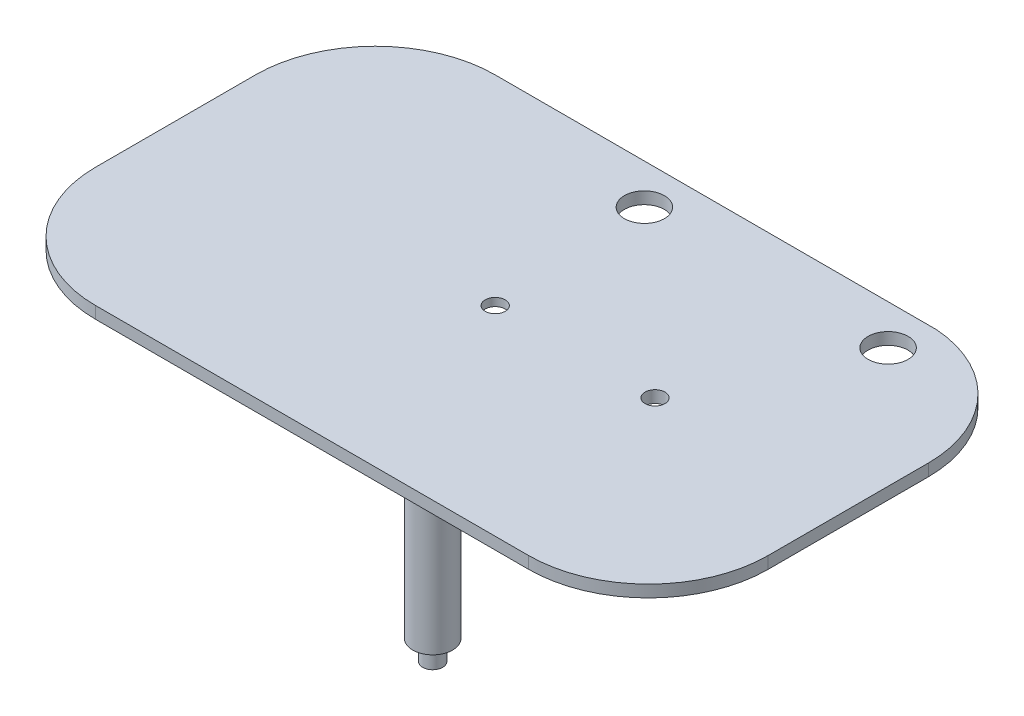
ISO-10303-21;
HEADER;
FILE_DESCRIPTION(('STEP AP214'),'2;1');
FILE_NAME('part.step','',(''),(''),'','','');
FILE_SCHEMA(('AUTOMOTIVE_DESIGN { 1 0 10303 214 1 1 1 1 }'));
ENDSEC;
DATA;
#1=APPLICATION_CONTEXT('core data for automotive mechanical design processes');
#2=APPLICATION_PROTOCOL_DEFINITION('international standard','automotive_design',2000,#1);
#3=PRODUCT_CONTEXT('',#1,'mechanical');
#4=PRODUCT('Part','Part','',(#3));
#5=PRODUCT_RELATED_PRODUCT_CATEGORY('part','',(#4));
#6=PRODUCT_DEFINITION_FORMATION('','',#4);
#7=PRODUCT_DEFINITION_CONTEXT('part definition',#1,'design');
#8=PRODUCT_DEFINITION('design','',#6,#7);
#9=PRODUCT_DEFINITION_SHAPE('','',#8);
#10=(LENGTH_UNIT() NAMED_UNIT(*) SI_UNIT(.MILLI.,.METRE.));
#11=(NAMED_UNIT(*) PLANE_ANGLE_UNIT() SI_UNIT($,.RADIAN.));
#12=(NAMED_UNIT(*) SI_UNIT($,.STERADIAN.) SOLID_ANGLE_UNIT());
#13=UNCERTAINTY_MEASURE_WITH_UNIT(LENGTH_MEASURE(1.E-05),#10,'distance_accuracy_value','');
#14=(GEOMETRIC_REPRESENTATION_CONTEXT(3) GLOBAL_UNCERTAINTY_ASSIGNED_CONTEXT((#13)) GLOBAL_UNIT_ASSIGNED_CONTEXT((#10,
#11,#12)) REPRESENTATION_CONTEXT('',''));
#15=CARTESIAN_POINT('',(0.,0.,0.));
#16=DIRECTION('',(0.,0.,1.));
#17=DIRECTION('',(1.,0.,0.));
#18=AXIS2_PLACEMENT_3D('',#15,#16,#17);
#19=CARTESIAN_POINT('',(-50.,37.,0.));
#20=DIRECTION('',(0.,1.,0.));
#21=DIRECTION('',(0.,0.,1.));
#22=AXIS2_PLACEMENT_3D('',#19,#20,#21);
#23=PLANE('',#22);
#24=CARTESIAN_POINT('',(57.3565923518305,37.,93.));
#25=DIRECTION('',(0.,1.,0.));
#26=DIRECTION('',(0.,0.,1.));
#27=AXIS2_PLACEMENT_3D('',#24,#25,#26);
#28=CIRCLE('',#27,5.);
#29=CARTESIAN_POINT('',(57.3565923518305,37.,98.));
#30=VERTEX_POINT('',#29);
#31=EDGE_CURVE('E46',#30,#30,#28,.F.);
#32=ORIENTED_EDGE('',*,*,#31,.F.);
#33=EDGE_LOOP('',(#32));
#34=FACE_BOUND('',#33,.T.);
#35=CARTESIAN_POINT('',(70.,37.,50.));
#36=DIRECTION('',(0.,1.,0.));
#37=DIRECTION('',(0.,0.,1.));
#38=AXIS2_PLACEMENT_3D('',#35,#36,#37);
#39=CIRCLE('',#38,2.5);
#40=CARTESIAN_POINT('',(70.,37.,52.5));
#41=VERTEX_POINT('',#40);
#42=EDGE_CURVE('E166',#41,#41,#39,.T.);
#43=ORIENTED_EDGE('',*,*,#42,.T.);
#44=EDGE_LOOP('',(#43));
#45=FACE_BOUND('',#44,.T.);
#46=CARTESIAN_POINT('',(30.,37.,50.));
#47=DIRECTION('',(0.,-1.,0.));
#48=DIRECTION('',(0.,0.,-1.));
#49=AXIS2_PLACEMENT_3D('',#46,#47,#48);
#50=CIRCLE('',#49,6.35);
#51=CARTESIAN_POINT('',(30.,37.,43.65));
#52=VERTEX_POINT('',#51);
#53=EDGE_CURVE('E171',#52,#52,#50,.T.);
#54=ORIENTED_EDGE('',*,*,#53,.F.);
#55=EDGE_LOOP('',(#54));
#56=FACE_BOUND('',#55,.T.);
#57=CARTESIAN_POINT('',(88.3346252635513,37.,70.));
#58=DIRECTION('',(0.,1.,0.));
#59=DIRECTION('',(0.,0.,1.));
#60=AXIS2_PLACEMENT_3D('',#57,#58,#59);
#61=CIRCLE('',#60,30.);
#62=CARTESIAN_POINT('',(118.334625263551,37.,70.));
#63=VERTEX_POINT('',#62);
#64=CARTESIAN_POINT('',(88.3346252635513,37.,100.));
#65=VERTEX_POINT('',#64);
#66=EDGE_CURVE('E163',#63,#65,#61,.F.);
#67=ORIENTED_EDGE('',*,*,#66,.T.);
#68=DIRECTION('',(-1.,0.,0.));
#69=VECTOR('',#68,1.);
#70=CARTESIAN_POINT('',(-50.,37.,100.));
#71=LINE('',#70,#69);
#72=CARTESIAN_POINT('',(-20.,37.,100.));
#73=VERTEX_POINT('',#72);
#74=EDGE_CURVE('E126',#65,#73,#71,.T.);
#75=ORIENTED_EDGE('',*,*,#74,.T.);
#76=CARTESIAN_POINT('',(-20.,37.,70.));
#77=DIRECTION('',(0.,1.,0.));
#78=DIRECTION('',(0.,0.,1.));
#79=AXIS2_PLACEMENT_3D('',#76,#77,#78);
#80=CIRCLE('',#79,30.);
#81=CARTESIAN_POINT('',(-50.,37.,70.));
#82=VERTEX_POINT('',#81);
#83=EDGE_CURVE('E139',#73,#82,#80,.F.);
#84=ORIENTED_EDGE('',*,*,#83,.T.);
#85=DIRECTION('',(0.,0.,1.));
#86=VECTOR('',#85,1.);
#87=CARTESIAN_POINT('',(-50.,37.,0.));
#88=LINE('',#87,#86);
#89=CARTESIAN_POINT('',(-50.,37.,30.));
#90=VERTEX_POINT('',#89);
#91=EDGE_CURVE('E177',#90,#82,#88,.T.);
#92=ORIENTED_EDGE('',*,*,#91,.F.);
#93=CARTESIAN_POINT('',(-20.,37.,30.));
#94=DIRECTION('',(0.,1.,0.));
#95=DIRECTION('',(0.,0.,1.));
#96=AXIS2_PLACEMENT_3D('',#93,#94,#95);
#97=CIRCLE('',#96,30.);
#98=CARTESIAN_POINT('',(-20.,37.,0.));
#99=VERTEX_POINT('',#98);
#100=EDGE_CURVE('E60',#90,#99,#97,.F.);
#101=ORIENTED_EDGE('',*,*,#100,.T.);
#102=DIRECTION('',(-1.,0.,0.));
#103=VECTOR('',#102,1.);
#104=CARTESIAN_POINT('',(-50.,37.,0.));
#105=LINE('',#104,#103);
#106=CARTESIAN_POINT('',(90.5,37.,0.));
#107=VERTEX_POINT('',#106);
#108=EDGE_CURVE('E143',#107,#99,#105,.T.);
#109=ORIENTED_EDGE('',*,*,#108,.F.);
#110=CARTESIAN_POINT('',(88.3346252635513,37.,29.921750487743));
#111=DIRECTION('',(0.,1.,0.));
#112=DIRECTION('',(0.,0.,1.));
#113=AXIS2_PLACEMENT_3D('',#110,#111,#112);
#114=CIRCLE('',#113,30.);
#115=CARTESIAN_POINT('',(118.334625263551,37.,29.921750487743));
#116=VERTEX_POINT('',#115);
#117=EDGE_CURVE('E161',#107,#116,#114,.F.);
#118=ORIENTED_EDGE('',*,*,#117,.T.);
#119=DIRECTION('',(0.,0.,-1.));
#120=VECTOR('',#119,1.);
#121=CARTESIAN_POINT('',(118.334625263551,37.,0.));
#122=LINE('',#121,#120);
#123=EDGE_CURVE('E156',#63,#116,#122,.T.);
#124=ORIENTED_EDGE('',*,*,#123,.F.);
#125=EDGE_LOOP('',(#67,#75,#84,#92,#101,#109,#118,#124));
#126=FACE_BOUND('',#125,.T.);
#127=CARTESIAN_POINT('',(27.3346252635511,37.,10.));
#128=DIRECTION('',(0.,-1.,0.));
#129=DIRECTION('',(0.,0.,-1.));
#130=AXIS2_PLACEMENT_3D('',#127,#128,#129);
#131=CIRCLE('',#130,5.);
#132=CARTESIAN_POINT('',(27.3346252635511,37.,5.));
#133=VERTEX_POINT('',#132);
#134=EDGE_CURVE('E215',#133,#133,#131,.T.);
#135=ORIENTED_EDGE('',*,*,#134,.F.);
#136=EDGE_LOOP('',(#135));
#137=FACE_BOUND('',#136,.T.);
#138=CARTESIAN_POINT('',(88.3346252635511,37.,10.));
#139=DIRECTION('',(0.,-1.,0.));
#140=DIRECTION('',(0.,0.,-1.));
#141=AXIS2_PLACEMENT_3D('',#138,#139,#140);
#142=CIRCLE('',#141,5.);
#143=CARTESIAN_POINT('',(88.3346252635511,37.,5.));
#144=VERTEX_POINT('',#143);
#145=EDGE_CURVE('E218',#144,#144,#142,.T.);
#146=ORIENTED_EDGE('',*,*,#145,.F.);
#147=EDGE_LOOP('',(#146));
#148=FACE_BOUND('',#147,.T.);
#149=ADVANCED_FACE('F42',(#34,#45,#56,#126,#137,#148),#23,.F.);
#150=CARTESIAN_POINT('',(0.,40.,0.));
#151=DIRECTION('',(0.,-1.,0.));
#152=DIRECTION('',(0.,0.,-1.));
#153=AXIS2_PLACEMENT_3D('',#150,#151,#152);
#154=PLANE('',#153);
#155=CARTESIAN_POINT('',(-20.,40.,70.));
#156=DIRECTION('',(0.,-1.,0.));
#157=DIRECTION('',(0.,0.,-1.));
#158=AXIS2_PLACEMENT_3D('',#155,#156,#157);
#159=CIRCLE('',#158,30.);
#160=CARTESIAN_POINT('',(-50.,40.,70.));
#161=VERTEX_POINT('',#160);
#162=CARTESIAN_POINT('',(-20.,40.,100.));
#163=VERTEX_POINT('',#162);
#164=EDGE_CURVE('E114',#161,#163,#159,.F.);
#165=ORIENTED_EDGE('',*,*,#164,.T.);
#166=DIRECTION('',(-1.,0.,0.));
#167=VECTOR('',#166,1.);
#168=CARTESIAN_POINT('',(150.,40.,100.));
#169=LINE('',#168,#167);
#170=CARTESIAN_POINT('',(88.3346252635513,40.,100.));
#171=VERTEX_POINT('',#170);
#172=EDGE_CURVE('E118',#171,#163,#169,.T.);
#173=ORIENTED_EDGE('',*,*,#172,.F.);
#174=CARTESIAN_POINT('',(88.3346252635513,40.,70.));
#175=DIRECTION('',(0.,-1.,0.));
#176=DIRECTION('',(0.,0.,-1.));
#177=AXIS2_PLACEMENT_3D('',#174,#175,#176);
#178=CIRCLE('',#177,30.);
#179=CARTESIAN_POINT('',(118.334625263551,40.,70.));
#180=VERTEX_POINT('',#179);
#181=EDGE_CURVE('E125',#171,#180,#178,.F.);
#182=ORIENTED_EDGE('',*,*,#181,.T.);
#183=DIRECTION('',(0.,0.,1.));
#184=VECTOR('',#183,1.);
#185=CARTESIAN_POINT('',(118.334625263551,40.,0.));
#186=LINE('',#185,#184);
#187=CARTESIAN_POINT('',(118.334625263551,40.,29.921750487743));
#188=VERTEX_POINT('',#187);
#189=EDGE_CURVE('E155',#188,#180,#186,.T.);
#190=ORIENTED_EDGE('',*,*,#189,.F.);
#191=CARTESIAN_POINT('',(88.3346252635513,40.,29.921750487743));
#192=DIRECTION('',(0.,-1.,0.));
#193=DIRECTION('',(0.,0.,-1.));
#194=AXIS2_PLACEMENT_3D('',#191,#192,#193);
#195=CIRCLE('',#194,30.);
#196=CARTESIAN_POINT('',(90.5,40.,0.));
#197=VERTEX_POINT('',#196);
#198=EDGE_CURVE('E148',#188,#197,#195,.F.);
#199=ORIENTED_EDGE('',*,*,#198,.T.);
#200=DIRECTION('',(1.,0.,0.));
#201=VECTOR('',#200,1.);
#202=CARTESIAN_POINT('',(-50.,40.,0.));
#203=LINE('',#202,#201);
#204=CARTESIAN_POINT('',(-20.,40.,0.));
#205=VERTEX_POINT('',#204);
#206=EDGE_CURVE('E85',#205,#197,#203,.T.);
#207=ORIENTED_EDGE('',*,*,#206,.F.);
#208=CARTESIAN_POINT('',(-20.,40.,30.));
#209=DIRECTION('',(0.,-1.,0.));
#210=DIRECTION('',(0.,0.,-1.));
#211=AXIS2_PLACEMENT_3D('',#208,#209,#210);
#212=CIRCLE('',#211,30.);
#213=CARTESIAN_POINT('',(-50.,40.,30.));
#214=VERTEX_POINT('',#213);
#215=EDGE_CURVE('E150',#205,#214,#212,.F.);
#216=ORIENTED_EDGE('',*,*,#215,.T.);
#217=DIRECTION('',(0.,0.,-1.));
#218=VECTOR('',#217,1.);
#219=CARTESIAN_POINT('',(-50.,40.,100.));
#220=LINE('',#219,#218);
#221=EDGE_CURVE('E121',#161,#214,#220,.T.);
#222=ORIENTED_EDGE('',*,*,#221,.F.);
#223=EDGE_LOOP('',(#165,#173,#182,#190,#199,#207,#216,#222));
#224=FACE_BOUND('',#223,.T.);
#225=CARTESIAN_POINT('',(30.,40.,50.));
#226=DIRECTION('',(0.,1.,0.));
#227=DIRECTION('',(0.,0.,1.));
#228=AXIS2_PLACEMENT_3D('',#225,#226,#227);
#229=CIRCLE('',#228,2.5);
#230=CARTESIAN_POINT('',(30.,40.,52.5));
#231=VERTEX_POINT('',#230);
#232=EDGE_CURVE('E140',#231,#231,#229,.T.);
#233=ORIENTED_EDGE('',*,*,#232,.F.);
#234=EDGE_LOOP('',(#233));
#235=FACE_BOUND('',#234,.T.);
#236=CARTESIAN_POINT('',(70.,40.,50.));
#237=DIRECTION('',(0.,1.,0.));
#238=DIRECTION('',(0.,0.,1.));
#239=AXIS2_PLACEMENT_3D('',#236,#237,#238);
#240=CIRCLE('',#239,2.5);
#241=CARTESIAN_POINT('',(70.,40.,52.5));
#242=VERTEX_POINT('',#241);
#243=EDGE_CURVE('E186',#242,#242,#240,.T.);
#244=ORIENTED_EDGE('',*,*,#243,.F.);
#245=EDGE_LOOP('',(#244));
#246=FACE_BOUND('',#245,.T.);
#247=CARTESIAN_POINT('',(27.3346252635511,40.,10.));
#248=DIRECTION('',(0.,-1.,0.));
#249=DIRECTION('',(0.,0.,-1.));
#250=AXIS2_PLACEMENT_3D('',#247,#248,#249);
#251=CIRCLE('',#250,5.);
#252=CARTESIAN_POINT('',(27.3346252635511,40.,5.));
#253=VERTEX_POINT('',#252);
#254=EDGE_CURVE('E225',#253,#253,#251,.T.);
#255=ORIENTED_EDGE('',*,*,#254,.T.);
#256=EDGE_LOOP('',(#255));
#257=FACE_BOUND('',#256,.T.);
#258=CARTESIAN_POINT('',(88.3346252635511,40.,10.));
#259=DIRECTION('',(0.,-1.,0.));
#260=DIRECTION('',(0.,0.,-1.));
#261=AXIS2_PLACEMENT_3D('',#258,#259,#260);
#262=CIRCLE('',#261,5.);
#263=CARTESIAN_POINT('',(88.3346252635511,40.,5.));
#264=VERTEX_POINT('',#263);
#265=EDGE_CURVE('E220',#264,#264,#262,.T.);
#266=ORIENTED_EDGE('',*,*,#265,.T.);
#267=EDGE_LOOP('',(#266));
#268=FACE_BOUND('',#267,.T.);
#269=ADVANCED_FACE('F116',(#224,#235,#246,#257,#268),#154,.F.);
#270=CARTESIAN_POINT('',(150.,40.,100.));
#271=DIRECTION('',(0.,0.,1.));
#272=DIRECTION('',(1.,0.,0.));
#273=AXIS2_PLACEMENT_3D('',#270,#271,#272);
#274=PLANE('',#273);
#275=ORIENTED_EDGE('',*,*,#74,.F.);
#276=DIRECTION('',(0.,-1.,0.));
#277=VECTOR('',#276,1.);
#278=CARTESIAN_POINT('',(88.3346252635513,40.,100.));
#279=LINE('',#278,#277);
#280=EDGE_CURVE('E135',#65,#171,#279,.F.);
#281=ORIENTED_EDGE('',*,*,#280,.T.);
#282=ORIENTED_EDGE('',*,*,#172,.T.);
#283=DIRECTION('',(0.,-1.,0.));
#284=VECTOR('',#283,1.);
#285=CARTESIAN_POINT('',(-20.,40.,100.));
#286=LINE('',#285,#284);
#287=EDGE_CURVE('E132',#163,#73,#286,.T.);
#288=ORIENTED_EDGE('',*,*,#287,.T.);
#289=EDGE_LOOP('',(#275,#281,#282,#288));
#290=FACE_BOUND('',#289,.T.);
#291=ADVANCED_FACE('F131',(#290),#274,.T.);
#292=CARTESIAN_POINT('',(30.,-50.,50.));
#293=DIRECTION('',(0.,1.,0.));
#294=DIRECTION('',(0.,0.,1.));
#295=AXIS2_PLACEMENT_3D('',#292,#293,#294);
#296=CYLINDRICAL_SURFACE('',#295,2.5);
#297=CARTESIAN_POINT('',(30.,38.,50.));
#298=DIRECTION('',(0.,-1.,0.));
#299=DIRECTION('',(0.,0.,-1.));
#300=AXIS2_PLACEMENT_3D('',#297,#298,#299);
#301=CIRCLE('',#300,2.5);
#302=CARTESIAN_POINT('',(30.,38.,52.5));
#303=VERTEX_POINT('',#302);
#304=EDGE_CURVE('E168',#303,#303,#301,.F.);
#305=CARTESIAN_POINT('',(30.,40.,52.5));
#306=CARTESIAN_POINT('',(30.,39.9791666666667,52.5));
#307=CARTESIAN_POINT('',(30.,39.9583333333333,52.5));
#308=CARTESIAN_POINT('',(30.,39.9166666666667,52.5));
#309=CARTESIAN_POINT('',(30.,39.8958333333333,52.5));
#310=CARTESIAN_POINT('',(30.,39.8541666666667,52.5));
#311=CARTESIAN_POINT('',(30.,39.8333333333333,52.5));
#312=CARTESIAN_POINT('',(30.,39.7916666666667,52.5));
#313=CARTESIAN_POINT('',(30.,39.7708333333333,52.5));
#314=CARTESIAN_POINT('',(30.,39.7291666666667,52.5));
#315=CARTESIAN_POINT('',(30.,39.7083333333333,52.5));
#316=CARTESIAN_POINT('',(30.,39.6666666666667,52.5));
#317=CARTESIAN_POINT('',(30.,39.6458333333333,52.5));
#318=CARTESIAN_POINT('',(30.,39.6041666666667,52.5));
#319=CARTESIAN_POINT('',(30.,39.5833333333333,52.5));
#320=CARTESIAN_POINT('',(30.,39.5416666666667,52.5));
#321=CARTESIAN_POINT('',(30.,39.5208333333333,52.5));
#322=CARTESIAN_POINT('',(30.,39.4791666666667,52.5));
#323=CARTESIAN_POINT('',(30.,39.4583333333333,52.5));
#324=CARTESIAN_POINT('',(30.,39.4166666666667,52.5));
#325=CARTESIAN_POINT('',(30.,39.3958333333333,52.5));
#326=CARTESIAN_POINT('',(30.,39.3541666666667,52.5));
#327=CARTESIAN_POINT('',(30.,39.3333333333333,52.5));
#328=CARTESIAN_POINT('',(30.,39.2916666666667,52.5));
#329=CARTESIAN_POINT('',(30.,39.2708333333333,52.5));
#330=CARTESIAN_POINT('',(30.,39.2291666666667,52.5));
#331=CARTESIAN_POINT('',(30.,39.2083333333333,52.5));
#332=CARTESIAN_POINT('',(30.,39.1666666666667,52.5));
#333=CARTESIAN_POINT('',(30.,39.1458333333333,52.5));
#334=CARTESIAN_POINT('',(30.,39.1041666666667,52.5));
#335=CARTESIAN_POINT('',(30.,39.0833333333333,52.5));
#336=CARTESIAN_POINT('',(30.,39.0416666666667,52.5));
#337=CARTESIAN_POINT('',(30.,39.0208333333333,52.5));
#338=CARTESIAN_POINT('',(30.,38.9791666666667,52.5));
#339=CARTESIAN_POINT('',(30.,38.9583333333333,52.5));
#340=CARTESIAN_POINT('',(30.,38.9166666666667,52.5));
#341=CARTESIAN_POINT('',(30.,38.8958333333333,52.5));
#342=CARTESIAN_POINT('',(30.,38.8541666666667,52.5));
#343=CARTESIAN_POINT('',(30.,38.8333333333333,52.5));
#344=CARTESIAN_POINT('',(30.,38.7916666666667,52.5));
#345=CARTESIAN_POINT('',(30.,38.7708333333333,52.5));
#346=CARTESIAN_POINT('',(30.,38.7291666666667,52.5));
#347=CARTESIAN_POINT('',(30.,38.7083333333333,52.5));
#348=CARTESIAN_POINT('',(30.,38.6666666666667,52.5));
#349=CARTESIAN_POINT('',(30.,38.6458333333333,52.5));
#350=CARTESIAN_POINT('',(30.,38.6041666666667,52.5));
#351=CARTESIAN_POINT('',(30.,38.5833333333333,52.5));
#352=CARTESIAN_POINT('',(30.,38.5416666666667,52.5));
#353=CARTESIAN_POINT('',(30.,38.5208333333333,52.5));
#354=CARTESIAN_POINT('',(30.,38.4791666666667,52.5));
#355=CARTESIAN_POINT('',(30.,38.4583333333333,52.5));
#356=CARTESIAN_POINT('',(30.,38.4166666666667,52.5));
#357=CARTESIAN_POINT('',(30.,38.3958333333333,52.5));
#358=CARTESIAN_POINT('',(30.,38.3541666666667,52.5));
#359=CARTESIAN_POINT('',(30.,38.3333333333333,52.5));
#360=CARTESIAN_POINT('',(30.,38.2916666666667,52.5));
#361=CARTESIAN_POINT('',(30.,38.2708333333333,52.5));
#362=CARTESIAN_POINT('',(30.,38.2291666666667,52.5));
#363=CARTESIAN_POINT('',(30.,38.2083333333333,52.5));
#364=CARTESIAN_POINT('',(30.,38.1666666666667,52.5));
#365=CARTESIAN_POINT('',(30.,38.1458333333333,52.5));
#366=CARTESIAN_POINT('',(30.,38.1041666666667,52.5));
#367=CARTESIAN_POINT('',(30.,38.0833333333333,52.5));
#368=CARTESIAN_POINT('',(30.,38.0416666666667,52.5));
#369=CARTESIAN_POINT('',(30.,38.0208333333333,52.5));
#370=CARTESIAN_POINT('',(30.,38.,52.5));
#371=B_SPLINE_CURVE_WITH_KNOTS('',3,(#305,#306,#307,#308,#309,#310,#311,#312,#313,#314,#315,
#316,#317,#318,#319,#320,#321,#322,#323,#324,#325,#326,#327,#328,#329,#330,#331,#332,#333,#334,
#335,#336,#337,#338,#339,#340,#341,#342,#343,#344,#345,#346,#347,#348,#349,#350,#351,#352,#353,
#354,#355,#356,#357,#358,#359,#360,#361,#362,#363,#364,#365,#366,#367,#368,#369,#370),
.UNSPECIFIED.,.F.,.F.,(4,2,2,2,2,2,2,2,2,2,2,2,2,2,2,2,2,2,2,2,2,2,2,2,2,2,2,2,2,2,2,2,4),(0.,
0.0624999999999931,0.125,0.187499999999993,0.25,0.312499999999993,0.375,0.437499999999993,0.5,
0.562499999999994,0.624999999999987,0.687499999999994,0.749999999999987,0.812499999999994,
0.874999999999987,0.937499999999994,0.999999999999987,1.06249999999998,1.12499999999999,
1.18749999999998,1.24999999999999,1.31249999999998,1.37499999999999,1.43749999999998,
1.49999999999997,1.56249999999998,1.62499999999997,1.68749999999998,1.74999999999997,
1.81249999999998,1.87499999999997,1.93749999999998,1.99999999999997),.UNSPECIFIED.);
#372=EDGE_CURVE('BSEAM274',#231,#303,#371,.T.);
#373=ORIENTED_EDGE('',*,*,#232,.T.);
#374=ORIENTED_EDGE('',*,*,#304,.F.);
#375=ORIENTED_EDGE('',*,*,#372,.T.);
#376=ORIENTED_EDGE('',*,*,#372,.F.);
#377=EDGE_LOOP('',(#373,#375,#374,#376));
#378=FACE_BOUND('',#377,.T.);
#379=ADVANCED_FACE('F274',(#378),#296,.F.);
#380=CARTESIAN_POINT('',(-50.,40.,0.));
#381=DIRECTION('',(0.,0.,-1.));
#382=DIRECTION('',(-1.,0.,0.));
#383=AXIS2_PLACEMENT_3D('',#380,#381,#382);
#384=PLANE('',#383);
#385=ORIENTED_EDGE('',*,*,#108,.T.);
#386=DIRECTION('',(0.,-1.,0.));
#387=VECTOR('',#386,1.);
#388=CARTESIAN_POINT('',(-20.,40.,0.));
#389=LINE('',#388,#387);
#390=EDGE_CURVE('E178',#99,#205,#389,.F.);
#391=ORIENTED_EDGE('',*,*,#390,.T.);
#392=ORIENTED_EDGE('',*,*,#206,.T.);
#393=DIRECTION('',(0.,1.,0.));
#394=VECTOR('',#393,1.);
#395=CARTESIAN_POINT('',(90.5,-50.,0.));
#396=LINE('',#395,#394);
#397=EDGE_CURVE('E160',#107,#197,#396,.T.);
#398=ORIENTED_EDGE('',*,*,#397,.F.);
#399=EDGE_LOOP('',(#385,#391,#392,#398));
#400=FACE_BOUND('',#399,.T.);
#401=ADVANCED_FACE('F246',(#400),#384,.T.);
#402=CARTESIAN_POINT('',(-50.,40.,100.));
#403=DIRECTION('',(-1.,0.,0.));
#404=DIRECTION('',(0.,0.,1.));
#405=AXIS2_PLACEMENT_3D('',#402,#403,#404);
#406=PLANE('',#405);
#407=ORIENTED_EDGE('',*,*,#91,.T.);
#408=DIRECTION('',(0.,-1.,0.));
#409=VECTOR('',#408,1.);
#410=CARTESIAN_POINT('',(-50.,40.,70.));
#411=LINE('',#410,#409);
#412=EDGE_CURVE('E174',#82,#161,#411,.F.);
#413=ORIENTED_EDGE('',*,*,#412,.T.);
#414=ORIENTED_EDGE('',*,*,#221,.T.);
#415=DIRECTION('',(0.,-1.,0.));
#416=VECTOR('',#415,1.);
#417=CARTESIAN_POINT('',(-50.,40.,30.));
#418=LINE('',#417,#416);
#419=EDGE_CURVE('E173',#214,#90,#418,.T.);
#420=ORIENTED_EDGE('',*,*,#419,.T.);
#421=EDGE_LOOP('',(#407,#413,#414,#420));
#422=FACE_BOUND('',#421,.T.);
#423=ADVANCED_FACE('F236',(#422),#406,.T.);
#424=CARTESIAN_POINT('',(70.,-50.,50.));
#425=DIRECTION('',(0.,1.,0.));
#426=DIRECTION('',(0.,0.,1.));
#427=AXIS2_PLACEMENT_3D('',#424,#425,#426);
#428=CYLINDRICAL_SURFACE('',#427,2.5);
#429=CARTESIAN_POINT('',(70.,40.,52.5));
#430=CARTESIAN_POINT('',(70.,39.96875,52.5));
#431=CARTESIAN_POINT('',(70.,39.9375,52.5));
#432=CARTESIAN_POINT('',(70.,39.875,52.5));
#433=CARTESIAN_POINT('',(70.,39.84375,52.5));
#434=CARTESIAN_POINT('',(70.,39.78125,52.5));
#435=CARTESIAN_POINT('',(70.,39.75,52.5));
#436=CARTESIAN_POINT('',(70.,39.6875,52.5));
#437=CARTESIAN_POINT('',(70.,39.65625,52.5));
#438=CARTESIAN_POINT('',(70.,39.59375,52.5));
#439=CARTESIAN_POINT('',(70.,39.5625,52.5));
#440=CARTESIAN_POINT('',(70.,39.5,52.5));
#441=CARTESIAN_POINT('',(70.,39.46875,52.5));
#442=CARTESIAN_POINT('',(70.,39.40625,52.5));
#443=CARTESIAN_POINT('',(70.,39.375,52.5));
#444=CARTESIAN_POINT('',(70.,39.3125,52.5));
#445=CARTESIAN_POINT('',(70.,39.28125,52.5));
#446=CARTESIAN_POINT('',(70.,39.21875,52.5));
#447=CARTESIAN_POINT('',(70.,39.1875,52.5));
#448=CARTESIAN_POINT('',(70.,39.125,52.5));
#449=CARTESIAN_POINT('',(70.,39.09375,52.5));
#450=CARTESIAN_POINT('',(70.,39.03125,52.5));
#451=CARTESIAN_POINT('',(70.,39.,52.5));
#452=CARTESIAN_POINT('',(70.,38.9375,52.5));
#453=CARTESIAN_POINT('',(70.,38.90625,52.5));
#454=CARTESIAN_POINT('',(70.,38.84375,52.5));
#455=CARTESIAN_POINT('',(70.,38.8125,52.5));
#456=CARTESIAN_POINT('',(70.,38.75,52.5));
#457=CARTESIAN_POINT('',(70.,38.71875,52.5));
#458=CARTESIAN_POINT('',(70.,38.65625,52.5));
#459=CARTESIAN_POINT('',(70.,38.625,52.5));
#460=CARTESIAN_POINT('',(70.,38.5625,52.5));
#461=CARTESIAN_POINT('',(70.,38.53125,52.5));
#462=CARTESIAN_POINT('',(70.,38.46875,52.5));
#463=CARTESIAN_POINT('',(70.,38.4375,52.5));
#464=CARTESIAN_POINT('',(70.,38.375,52.5));
#465=CARTESIAN_POINT('',(70.,38.34375,52.5));
#466=CARTESIAN_POINT('',(70.,38.28125,52.5));
#467=CARTESIAN_POINT('',(70.,38.25,52.5));
#468=CARTESIAN_POINT('',(70.,38.1875,52.5));
#469=CARTESIAN_POINT('',(70.,38.15625,52.5));
#470=CARTESIAN_POINT('',(70.,38.09375,52.5));
#471=CARTESIAN_POINT('',(70.,38.0625,52.5));
#472=CARTESIAN_POINT('',(70.,38.,52.5));
#473=CARTESIAN_POINT('',(70.,37.96875,52.5));
#474=CARTESIAN_POINT('',(70.,37.90625,52.5));
#475=CARTESIAN_POINT('',(70.,37.875,52.5));
#476=CARTESIAN_POINT('',(70.,37.8125,52.5));
#477=CARTESIAN_POINT('',(70.,37.78125,52.5));
#478=CARTESIAN_POINT('',(70.,37.71875,52.5));
#479=CARTESIAN_POINT('',(70.,37.6875,52.5));
#480=CARTESIAN_POINT('',(70.,37.625,52.5));
#481=CARTESIAN_POINT('',(70.,37.59375,52.5));
#482=CARTESIAN_POINT('',(70.,37.53125,52.5));
#483=CARTESIAN_POINT('',(70.,37.5,52.5));
#484=CARTESIAN_POINT('',(70.,37.4375,52.5));
#485=CARTESIAN_POINT('',(70.,37.40625,52.5));
#486=CARTESIAN_POINT('',(70.,37.34375,52.5));
#487=CARTESIAN_POINT('',(70.,37.3125,52.5));
#488=CARTESIAN_POINT('',(70.,37.25,52.5));
#489=CARTESIAN_POINT('',(70.,37.21875,52.5));
#490=CARTESIAN_POINT('',(70.,37.15625,52.5));
#491=CARTESIAN_POINT('',(70.,37.125,52.5));
#492=CARTESIAN_POINT('',(70.,37.0625,52.5));
#493=CARTESIAN_POINT('',(70.,37.03125,52.5));
#494=CARTESIAN_POINT('',(70.,37.,52.5));
#495=B_SPLINE_CURVE_WITH_KNOTS('',3,(#429,#430,#431,#432,#433,#434,#435,#436,#437,#438,#439,
#440,#441,#442,#443,#444,#445,#446,#447,#448,#449,#450,#451,#452,#453,#454,#455,#456,#457,#458,
#459,#460,#461,#462,#463,#464,#465,#466,#467,#468,#469,#470,#471,#472,#473,#474,#475,#476,#477,
#478,#479,#480,#481,#482,#483,#484,#485,#486,#487,#488,#489,#490,#491,#492,#493,#494),
.UNSPECIFIED.,.F.,.F.,(4,2,2,2,2,2,2,2,2,2,2,2,2,2,2,2,2,2,2,2,2,2,2,2,2,2,2,2,2,2,2,2,4),(0.,
0.0937500000000036,0.187500000000007,0.281249999999997,0.375,0.468750000000004,
0.562499999999994,0.656249999999997,0.750000000000001,0.843750000000004,0.937500000000008,
1.03125,1.125,1.21875,1.31249999999999,1.40625,1.5,1.59375,1.68750000000001,1.78125,1.875,
1.96875000000001,2.06249999999999,2.15625,2.25,2.34375000000001,2.43750000000001,2.53125,2.625,
2.71875000000001,2.8125,2.90625,3.),.UNSPECIFIED.);
#496=EDGE_CURVE('BSEAM44',#242,#41,#495,.T.);
#497=ORIENTED_EDGE('',*,*,#243,.T.);
#498=ORIENTED_EDGE('',*,*,#42,.F.);
#499=ORIENTED_EDGE('',*,*,#496,.T.);
#500=ORIENTED_EDGE('',*,*,#496,.F.);
#501=EDGE_LOOP('',(#497,#499,#498,#500));
#502=FACE_BOUND('',#501,.T.);
#503=ADVANCED_FACE('F44',(#502),#428,.F.);
#504=CARTESIAN_POINT('',(30.,38.,50.));
#505=DIRECTION('',(0.,-1.,0.));
#506=DIRECTION('',(0.,0.,-1.));
#507=AXIS2_PLACEMENT_3D('',#504,#505,#506);
#508=PLANE('',#507);
#509=CARTESIAN_POINT('',(30.,38.,50.));
#510=DIRECTION('',(0.,-1.,0.));
#511=DIRECTION('',(0.,0.,-1.));
#512=AXIS2_PLACEMENT_3D('',#509,#510,#511);
#513=CIRCLE('',#512,6.35);
#514=CARTESIAN_POINT('',(30.,38.,43.65));
#515=VERTEX_POINT('',#514);
#516=EDGE_CURVE('E172',#515,#515,#513,.T.);
#517=ORIENTED_EDGE('',*,*,#516,.T.);
#518=EDGE_LOOP('',(#517));
#519=FACE_BOUND('',#518,.T.);
#520=ORIENTED_EDGE('',*,*,#304,.T.);
#521=EDGE_LOOP('',(#520));
#522=FACE_BOUND('',#521,.T.);
#523=ADVANCED_FACE('F269',(#519,#522),#508,.T.);
#524=CARTESIAN_POINT('',(30.,38.,50.));
#525=DIRECTION('',(0.,-1.,0.));
#526=DIRECTION('',(0.,0.,-1.));
#527=AXIS2_PLACEMENT_3D('',#524,#525,#526);
#528=CYLINDRICAL_SURFACE('',#527,6.35);
#529=ORIENTED_EDGE('',*,*,#516,.F.);
#530=EDGE_LOOP('',(#529));
#531=FACE_BOUND('',#530,.T.);
#532=ORIENTED_EDGE('',*,*,#53,.T.);
#533=EDGE_LOOP('',(#532));
#534=FACE_BOUND('',#533,.T.);
#535=ADVANCED_FACE('F266',(#531,#534),#528,.F.);
#536=CARTESIAN_POINT('',(118.334625263551,83.4152076037248,100.));
#537=DIRECTION('',(1.,0.,0.));
#538=DIRECTION('',(0.,1.,0.));
#539=AXIS2_PLACEMENT_3D('',#536,#537,#538);
#540=PLANE('',#539);
#541=ORIENTED_EDGE('',*,*,#123,.T.);
#542=DIRECTION('',(0.,-1.,0.));
#543=VECTOR('',#542,1.);
#544=CARTESIAN_POINT('',(118.334625263551,40.,29.921750487743));
#545=LINE('',#544,#543);
#546=EDGE_CURVE('E153',#116,#188,#545,.F.);
#547=ORIENTED_EDGE('',*,*,#546,.T.);
#548=ORIENTED_EDGE('',*,*,#189,.T.);
#549=DIRECTION('',(0.,-1.,0.));
#550=VECTOR('',#549,1.);
#551=CARTESIAN_POINT('',(118.334625263551,83.4152076037248,70.));
#552=LINE('',#551,#550);
#553=EDGE_CURVE('E157',#180,#63,#552,.T.);
#554=ORIENTED_EDGE('',*,*,#553,.T.);
#555=EDGE_LOOP('',(#541,#547,#548,#554));
#556=FACE_BOUND('',#555,.T.);
#557=ADVANCED_FACE('F243',(#556),#540,.T.);
#558=CARTESIAN_POINT('',(88.3346252635513,40.,29.921750487743));
#559=DIRECTION('',(0.,1.,0.));
#560=DIRECTION('',(0.,0.,1.));
#561=AXIS2_PLACEMENT_3D('',#558,#559,#560);
#562=CYLINDRICAL_SURFACE('',#561,30.);
#563=ORIENTED_EDGE('',*,*,#198,.F.);
#564=ORIENTED_EDGE('',*,*,#546,.F.);
#565=ORIENTED_EDGE('',*,*,#117,.F.);
#566=ORIENTED_EDGE('',*,*,#397,.T.);
#567=EDGE_LOOP('',(#563,#564,#565,#566));
#568=FACE_BOUND('',#567,.T.);
#569=ADVANCED_FACE('F245',(#568),#562,.T.);
#570=CARTESIAN_POINT('',(88.3346252635513,83.4152076037248,70.));
#571=DIRECTION('',(0.,-1.,0.));
#572=DIRECTION('',(1.,0.,0.));
#573=AXIS2_PLACEMENT_3D('',#570,#571,#572);
#574=CYLINDRICAL_SURFACE('',#573,30.);
#575=ORIENTED_EDGE('',*,*,#181,.F.);
#576=ORIENTED_EDGE('',*,*,#280,.F.);
#577=ORIENTED_EDGE('',*,*,#66,.F.);
#578=ORIENTED_EDGE('',*,*,#553,.F.);
#579=EDGE_LOOP('',(#575,#576,#577,#578));
#580=FACE_BOUND('',#579,.T.);
#581=ADVANCED_FACE('F239',(#580),#574,.T.);
#582=CARTESIAN_POINT('',(-20.,40.,70.));
#583=DIRECTION('',(0.,-1.,0.));
#584=DIRECTION('',(0.,0.,-1.));
#585=AXIS2_PLACEMENT_3D('',#582,#583,#584);
#586=CYLINDRICAL_SURFACE('',#585,30.);
#587=ORIENTED_EDGE('',*,*,#164,.F.);
#588=ORIENTED_EDGE('',*,*,#412,.F.);
#589=ORIENTED_EDGE('',*,*,#83,.F.);
#590=ORIENTED_EDGE('',*,*,#287,.F.);
#591=EDGE_LOOP('',(#587,#588,#589,#590));
#592=FACE_BOUND('',#591,.T.);
#593=ADVANCED_FACE('F137',(#592),#586,.T.);
#594=CARTESIAN_POINT('',(-20.,40.,30.));
#595=DIRECTION('',(0.,-1.,0.));
#596=DIRECTION('',(0.,0.,-1.));
#597=AXIS2_PLACEMENT_3D('',#594,#595,#596);
#598=CYLINDRICAL_SURFACE('',#597,30.);
#599=ORIENTED_EDGE('',*,*,#215,.F.);
#600=ORIENTED_EDGE('',*,*,#390,.F.);
#601=ORIENTED_EDGE('',*,*,#100,.F.);
#602=ORIENTED_EDGE('',*,*,#419,.F.);
#603=EDGE_LOOP('',(#599,#600,#601,#602));
#604=FACE_BOUND('',#603,.T.);
#605=ADVANCED_FACE('F247',(#604),#598,.T.);
#606=CARTESIAN_POINT('',(57.3565923518305,3.,93.));
#607=DIRECTION('',(0.,1.,0.));
#608=DIRECTION('',(0.,0.,1.));
#609=AXIS2_PLACEMENT_3D('',#606,#607,#608);
#610=CYLINDRICAL_SURFACE('',#609,5.);
#611=CARTESIAN_POINT('',(57.3565923518305,3.,93.));
#612=DIRECTION('',(0.,-1.,0.));
#613=DIRECTION('',(0.,0.,-1.));
#614=AXIS2_PLACEMENT_3D('',#611,#612,#613);
#615=CIRCLE('',#614,5.);
#616=CARTESIAN_POINT('',(57.3565923518305,3.,88.));
#617=VERTEX_POINT('',#616);
#618=EDGE_CURVE('E184',#617,#617,#615,.T.);
#619=ORIENTED_EDGE('',*,*,#618,.F.);
#620=EDGE_LOOP('',(#619));
#621=FACE_BOUND('',#620,.T.);
#622=ORIENTED_EDGE('',*,*,#31,.T.);
#623=EDGE_LOOP('',(#622));
#624=FACE_BOUND('',#623,.T.);
#625=ADVANCED_FACE('F202',(#621,#624),#610,.T.);
#626=CARTESIAN_POINT('',(0.,3.,0.));
#627=DIRECTION('',(0.,-1.,0.));
#628=DIRECTION('',(0.,0.,-1.));
#629=AXIS2_PLACEMENT_3D('',#626,#627,#628);
#630=PLANE('',#629);
#631=CARTESIAN_POINT('',(57.3565923518305,3.,93.));
#632=DIRECTION('',(0.,-1.,0.));
#633=DIRECTION('',(0.,0.,-1.));
#634=AXIS2_PLACEMENT_3D('',#631,#632,#633);
#635=CIRCLE('',#634,2.5);
#636=CARTESIAN_POINT('',(57.3565923518305,3.,90.5));
#637=VERTEX_POINT('',#636);
#638=EDGE_CURVE('E11',#637,#637,#635,.T.);
#639=ORIENTED_EDGE('',*,*,#638,.F.);
#640=EDGE_LOOP('',(#639));
#641=FACE_BOUND('',#640,.T.);
#642=ORIENTED_EDGE('',*,*,#618,.T.);
#643=EDGE_LOOP('',(#642));
#644=FACE_BOUND('',#643,.T.);
#645=ADVANCED_FACE('F254',(#641,#644),#630,.T.);
#646=CARTESIAN_POINT('',(57.3565923518305,-2.,93.));
#647=DIRECTION('',(0.,1.,0.));
#648=DIRECTION('',(0.,0.,1.));
#649=AXIS2_PLACEMENT_3D('',#646,#647,#648);
#650=CYLINDRICAL_SURFACE('',#649,2.5);
#651=CARTESIAN_POINT('',(57.3565923518305,-2.,93.));
#652=DIRECTION('',(0.,-1.,0.));
#653=DIRECTION('',(0.,0.,-1.));
#654=AXIS2_PLACEMENT_3D('',#651,#652,#653);
#655=CIRCLE('',#654,2.5);
#656=CARTESIAN_POINT('',(57.3565923518305,-2.,90.5));
#657=VERTEX_POINT('',#656);
#658=EDGE_CURVE('E228',#657,#657,#655,.T.);
#659=ORIENTED_EDGE('',*,*,#658,.F.);
#660=EDGE_LOOP('',(#659));
#661=FACE_BOUND('',#660,.T.);
#662=ORIENTED_EDGE('',*,*,#638,.T.);
#663=EDGE_LOOP('',(#662));
#664=FACE_BOUND('',#663,.T.);
#665=ADVANCED_FACE('F320',(#661,#664),#650,.T.);
#666=CARTESIAN_POINT('',(57.3565923518305,-2.,93.));
#667=DIRECTION('',(0.,-1.,0.));
#668=DIRECTION('',(0.,0.,-1.));
#669=AXIS2_PLACEMENT_3D('',#666,#667,#668);
#670=PLANE('',#669);
#671=ORIENTED_EDGE('',*,*,#658,.T.);
#672=EDGE_LOOP('',(#671));
#673=FACE_BOUND('',#672,.T.);
#674=ADVANCED_FACE('F329',(#673),#670,.T.);
#675=CARTESIAN_POINT('',(27.3346252635511,40.,10.));
#676=DIRECTION('',(0.,-1.,0.));
#677=DIRECTION('',(0.,0.,-1.));
#678=AXIS2_PLACEMENT_3D('',#675,#676,#677);
#679=CYLINDRICAL_SURFACE('',#678,5.);
#680=ORIENTED_EDGE('',*,*,#254,.F.);
#681=EDGE_LOOP('',(#680));
#682=FACE_BOUND('',#681,.T.);
#683=ORIENTED_EDGE('',*,*,#134,.T.);
#684=EDGE_LOOP('',(#683));
#685=FACE_BOUND('',#684,.T.);
#686=ADVANCED_FACE('F340',(#682,#685),#679,.F.);
#687=CARTESIAN_POINT('',(88.3346252635511,40.,10.));
#688=DIRECTION('',(0.,-1.,0.));
#689=DIRECTION('',(0.,0.,-1.));
#690=AXIS2_PLACEMENT_3D('',#687,#688,#689);
#691=CYLINDRICAL_SURFACE('',#690,5.);
#692=ORIENTED_EDGE('',*,*,#265,.F.);
#693=EDGE_LOOP('',(#692));
#694=FACE_BOUND('',#693,.T.);
#695=ORIENTED_EDGE('',*,*,#145,.T.);
#696=EDGE_LOOP('',(#695));
#697=FACE_BOUND('',#696,.T.);
#698=ADVANCED_FACE('F352',(#694,#697),#691,.F.);
#699=CLOSED_SHELL('',(#149,#269,#291,#379,#401,#423,#503,#523,#535,#557,#569,#581,#593,#605,
#625,#645,#665,#674,#686,#698));
#700=MANIFOLD_SOLID_BREP('B2',#699);
#701=ADVANCED_BREP_SHAPE_REPRESENTATION('',(#18,#700),#14);
#702=SHAPE_DEFINITION_REPRESENTATION(#9,#701);
ENDSEC;
END-ISO-10303-21;
